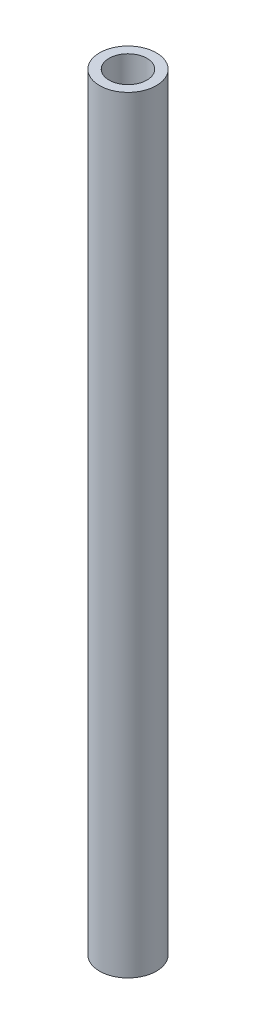
ISO-10303-21;
HEADER;
FILE_DESCRIPTION(('STEP AP214'),'2;1');
FILE_NAME('part.step','',(''),(''),'','','');
FILE_SCHEMA(('AUTOMOTIVE_DESIGN { 1 0 10303 214 1 1 1 1 }'));
ENDSEC;
DATA;
#1=APPLICATION_CONTEXT('core data for automotive mechanical design processes');
#2=APPLICATION_PROTOCOL_DEFINITION('international standard','automotive_design',2000,#1);
#3=PRODUCT_CONTEXT('',#1,'mechanical');
#4=PRODUCT('Part','Part','',(#3));
#5=PRODUCT_RELATED_PRODUCT_CATEGORY('part','',(#4));
#6=PRODUCT_DEFINITION_FORMATION('','',#4);
#7=PRODUCT_DEFINITION_CONTEXT('part definition',#1,'design');
#8=PRODUCT_DEFINITION('design','',#6,#7);
#9=PRODUCT_DEFINITION_SHAPE('','',#8);
#10=(LENGTH_UNIT() NAMED_UNIT(*) SI_UNIT(.MILLI.,.METRE.));
#11=(NAMED_UNIT(*) PLANE_ANGLE_UNIT() SI_UNIT($,.RADIAN.));
#12=(NAMED_UNIT(*) SI_UNIT($,.STERADIAN.) SOLID_ANGLE_UNIT());
#13=UNCERTAINTY_MEASURE_WITH_UNIT(LENGTH_MEASURE(1.E-05),#10,'distance_accuracy_value','');
#14=(GEOMETRIC_REPRESENTATION_CONTEXT(3) GLOBAL_UNCERTAINTY_ASSIGNED_CONTEXT((#13)) GLOBAL_UNIT_ASSIGNED_CONTEXT((#10,
#11,#12)) REPRESENTATION_CONTEXT('',''));
#15=CARTESIAN_POINT('',(0.,0.,0.));
#16=DIRECTION('',(0.,0.,1.));
#17=DIRECTION('',(1.,0.,0.));
#18=AXIS2_PLACEMENT_3D('',#15,#16,#17);
#19=CARTESIAN_POINT('',(-56.2916512459885,150.6,50.));
#20=DIRECTION('',(0.,1.,0.));
#21=DIRECTION('',(0.,0.,1.));
#22=AXIS2_PLACEMENT_3D('',#19,#20,#21);
#23=PLANE('',#22);
#24=CARTESIAN_POINT('',(-56.2916512459885,150.6,50.));
#25=DIRECTION('',(0.,1.,0.));
#26=DIRECTION('',(0.,0.,1.));
#27=AXIS2_PLACEMENT_3D('',#24,#25,#26);
#28=CIRCLE('',#27,3.);
#29=CARTESIAN_POINT('',(-56.2916512459885,150.6,53.));
#30=VERTEX_POINT('',#29);
#31=EDGE_CURVE('E10',#30,#30,#28,.T.);
#32=ORIENTED_EDGE('',*,*,#31,.T.);
#33=EDGE_LOOP('',(#32));
#34=FACE_BOUND('',#33,.T.);
#35=CARTESIAN_POINT('',(-56.2916512459885,150.6,50.));
#36=DIRECTION('',(0.,1.,0.));
#37=DIRECTION('',(0.,0.,1.));
#38=AXIS2_PLACEMENT_3D('',#35,#36,#37);
#39=CIRCLE('',#38,2.);
#40=CARTESIAN_POINT('',(-56.2916512459885,150.6,52.));
#41=VERTEX_POINT('',#40);
#42=EDGE_CURVE('E49',#41,#41,#39,.T.);
#43=ORIENTED_EDGE('',*,*,#42,.F.);
#44=EDGE_LOOP('',(#43));
#45=FACE_BOUND('',#44,.T.);
#46=ADVANCED_FACE('F39',(#34,#45),#23,.T.);
#47=CARTESIAN_POINT('',(-56.2916512459885,69.6,50.));
#48=DIRECTION('',(0.,1.,0.));
#49=DIRECTION('',(0.,0.,1.));
#50=AXIS2_PLACEMENT_3D('',#47,#48,#49);
#51=PLANE('',#50);
#52=CARTESIAN_POINT('',(-56.2916512459885,69.6,50.));
#53=DIRECTION('',(0.,1.,0.));
#54=DIRECTION('',(0.,0.,1.));
#55=AXIS2_PLACEMENT_3D('',#52,#53,#54);
#56=CIRCLE('',#55,3.);
#57=CARTESIAN_POINT('',(-56.2916512459885,69.6,53.));
#58=VERTEX_POINT('',#57);
#59=EDGE_CURVE('E43',#58,#58,#56,.T.);
#60=ORIENTED_EDGE('',*,*,#59,.F.);
#61=EDGE_LOOP('',(#60));
#62=FACE_BOUND('',#61,.T.);
#63=CARTESIAN_POINT('',(-56.2916512459885,69.6,50.));
#64=DIRECTION('',(0.,1.,0.));
#65=DIRECTION('',(0.,0.,1.));
#66=AXIS2_PLACEMENT_3D('',#63,#64,#65);
#67=CIRCLE('',#66,2.);
#68=CARTESIAN_POINT('',(-56.2916512459885,69.6,52.));
#69=VERTEX_POINT('',#68);
#70=EDGE_CURVE('E55',#69,#69,#67,.T.);
#71=ORIENTED_EDGE('',*,*,#70,.T.);
#72=EDGE_LOOP('',(#71));
#73=FACE_BOUND('',#72,.T.);
#74=ADVANCED_FACE('F65',(#62,#73),#51,.F.);
#75=CARTESIAN_POINT('',(-56.2916512459885,150.6,50.));
#76=DIRECTION('',(0.,-1.,0.));
#77=DIRECTION('',(0.,0.,-1.));
#78=AXIS2_PLACEMENT_3D('',#75,#76,#77);
#79=CYLINDRICAL_SURFACE('',#78,3.);
#80=ORIENTED_EDGE('',*,*,#31,.F.);
#81=EDGE_LOOP('',(#80));
#82=FACE_BOUND('',#81,.T.);
#83=ORIENTED_EDGE('',*,*,#59,.T.);
#84=EDGE_LOOP('',(#83));
#85=FACE_BOUND('',#84,.T.);
#86=ADVANCED_FACE('F41',(#82,#85),#79,.T.);
#87=CARTESIAN_POINT('',(-56.2916512459885,150.6,50.));
#88=DIRECTION('',(0.,-1.,0.));
#89=DIRECTION('',(0.,0.,-1.));
#90=AXIS2_PLACEMENT_3D('',#87,#88,#89);
#91=CYLINDRICAL_SURFACE('',#90,2.);
#92=ORIENTED_EDGE('',*,*,#42,.T.);
#93=EDGE_LOOP('',(#92));
#94=FACE_BOUND('',#93,.T.);
#95=ORIENTED_EDGE('',*,*,#70,.F.);
#96=EDGE_LOOP('',(#95));
#97=FACE_BOUND('',#96,.T.);
#98=ADVANCED_FACE('F59',(#94,#97),#91,.F.);
#99=CLOSED_SHELL('',(#46,#74,#86,#98));
#100=MANIFOLD_SOLID_BREP('B2',#99);
#101=ADVANCED_BREP_SHAPE_REPRESENTATION('',(#18,#100),#14);
#102=SHAPE_DEFINITION_REPRESENTATION(#9,#101);
ENDSEC;
END-ISO-10303-21;
